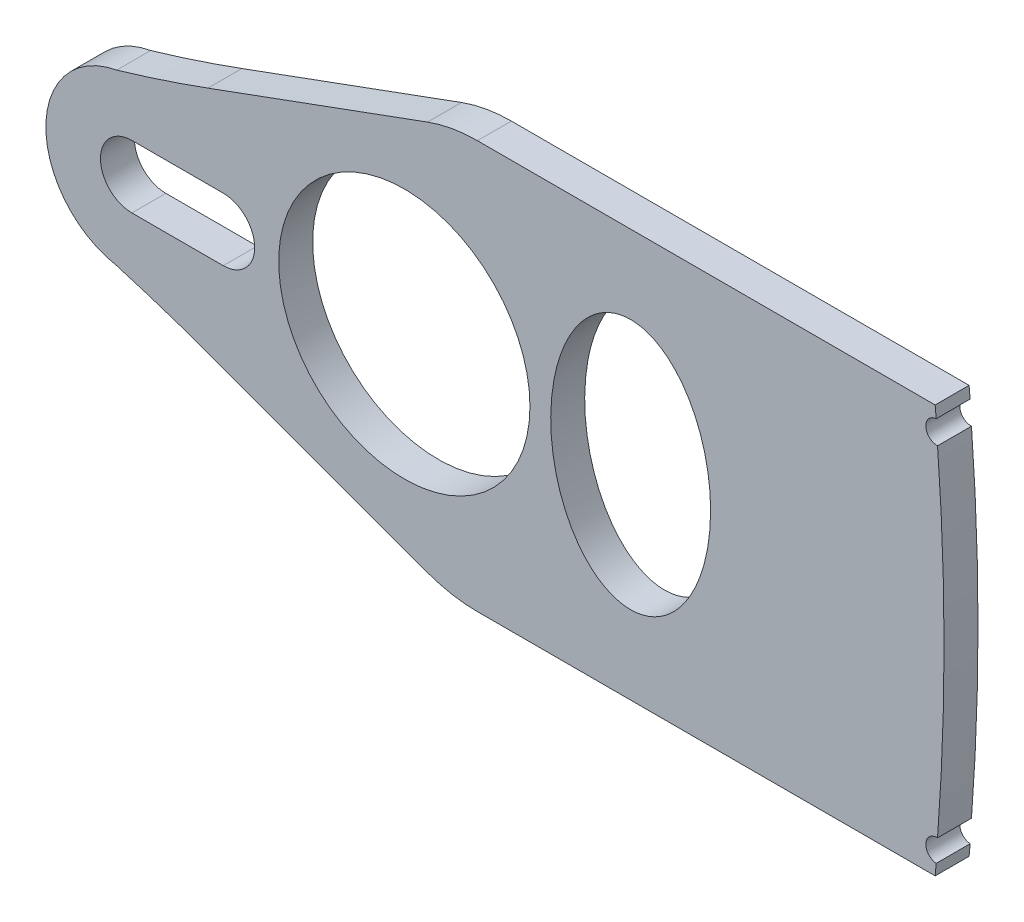
ISO-10303-21;
HEADER;
FILE_DESCRIPTION(('STEP AP214'),'2;1');
FILE_NAME('part.step','',(''),(''),'','','');
FILE_SCHEMA(('AUTOMOTIVE_DESIGN { 1 0 10303 214 1 1 1 1 }'));
ENDSEC;
DATA;
#1=APPLICATION_CONTEXT('core data for automotive mechanical design processes');
#2=APPLICATION_PROTOCOL_DEFINITION('international standard','automotive_design',2000,#1);
#3=PRODUCT_CONTEXT('',#1,'mechanical');
#4=PRODUCT('Part','Part','',(#3));
#5=PRODUCT_RELATED_PRODUCT_CATEGORY('part','',(#4));
#6=PRODUCT_DEFINITION_FORMATION('','',#4);
#7=PRODUCT_DEFINITION_CONTEXT('part definition',#1,'design');
#8=PRODUCT_DEFINITION('design','',#6,#7);
#9=PRODUCT_DEFINITION_SHAPE('','',#8);
#10=(LENGTH_UNIT() NAMED_UNIT(*) SI_UNIT(.MILLI.,.METRE.));
#11=(NAMED_UNIT(*) PLANE_ANGLE_UNIT() SI_UNIT($,.RADIAN.));
#12=(NAMED_UNIT(*) SI_UNIT($,.STERADIAN.) SOLID_ANGLE_UNIT());
#13=UNCERTAINTY_MEASURE_WITH_UNIT(LENGTH_MEASURE(1.E-05),#10,'distance_accuracy_value','');
#14=(GEOMETRIC_REPRESENTATION_CONTEXT(3) GLOBAL_UNCERTAINTY_ASSIGNED_CONTEXT((#13)) GLOBAL_UNIT_ASSIGNED_CONTEXT((#10,
#11,#12)) REPRESENTATION_CONTEXT('',''));
#15=CARTESIAN_POINT('',(0.,0.,0.));
#16=DIRECTION('',(0.,0.,1.));
#17=DIRECTION('',(1.,0.,0.));
#18=AXIS2_PLACEMENT_3D('',#15,#16,#17);
#19=CARTESIAN_POINT('',(-61.9531726060395,133.375978359004,3.));
#20=DIRECTION('',(0.,0.,-1.));
#21=DIRECTION('',(-1.,0.,0.));
#22=AXIS2_PLACEMENT_3D('',#19,#20,#21);
#23=PLANE('',#22);
#24=CARTESIAN_POINT('',(-61.9531726060395,133.375978359004,3.));
#25=DIRECTION('',(0.,0.,-1.));
#26=DIRECTION('',(-1.,0.,0.));
#27=AXIS2_PLACEMENT_3D('',#24,#25,#26);
#28=CIRCLE('',#27,128.167082660278);
#29=CARTESIAN_POINT('',(-17.8942149727587,13.0198014094375,3.));
#30=VERTEX_POINT('',#29);
#31=CARTESIAN_POINT('',(-25.9650650638676,10.3651772349564,3.));
#32=VERTEX_POINT('',#31);
#33=EDGE_CURVE('E222',#30,#32,#28,.T.);
#34=ORIENTED_EDGE('',*,*,#33,.T.);
#35=CARTESIAN_POINT('',(-24.6190531676033,2.88218977755966,3.));
#36=DIRECTION('',(0.,0.,1.));
#37=DIRECTION('',(1.,0.,0.));
#38=AXIS2_PLACEMENT_3D('',#35,#36,#37);
#39=CIRCLE('',#38,7.60308156686761);
#40=CARTESIAN_POINT('',(-25.9650650638673,-4.60079767983714,3.));
#41=VERTEX_POINT('',#40);
#42=EDGE_CURVE('E226',#32,#41,#39,.T.);
#43=ORIENTED_EDGE('',*,*,#42,.T.);
#44=CARTESIAN_POINT('',(-61.953172606039,-127.611598803884,3.));
#45=DIRECTION('',(0.,0.,-1.));
#46=DIRECTION('',(1.,0.,0.));
#47=AXIS2_PLACEMENT_3D('',#44,#45,#46);
#48=CIRCLE('',#47,128.167082660278);
#49=CARTESIAN_POINT('',(-17.8942149727582,-7.25542185431699,3.));
#50=VERTEX_POINT('',#49);
#51=EDGE_CURVE('E230',#41,#50,#48,.T.);
#52=ORIENTED_EDGE('',*,*,#51,.T.);
#53=DIRECTION('',(0.939056850256712,-0.343761882683264,0.));
#54=VECTOR('',#53,1.);
#55=CARTESIAN_POINT('',(-17.8942149727587,-7.25542185431823,3.));
#56=LINE('',#55,#54);
#57=CARTESIAN_POINT('',(1.50454556699025,-14.3567538376193,3.));
#58=VERTEX_POINT('',#57);
#59=EDGE_CURVE('E233',#50,#58,#56,.T.);
#60=ORIENTED_EDGE('',*,*,#59,.T.);
#61=CARTESIAN_POINT('',(5.91044133032117,-2.3211361426666,3.));
#62=DIRECTION('',(0.,0.,1.));
#63=DIRECTION('',(1.,0.,0.));
#64=AXIS2_PLACEMENT_3D('',#61,#62,#63);
#65=CIRCLE('',#64,12.8167082660263);
#66=CARTESIAN_POINT('',(5.91044133032854,-15.1378444086929,3.));
#67=VERTEX_POINT('',#66);
#68=EDGE_CURVE('E236',#58,#67,#65,.T.);
#69=ORIENTED_EDGE('',*,*,#68,.T.);
#70=DIRECTION('',(1.,0.,0.));
#71=VECTOR('',#70,1.);
#72=CARTESIAN_POINT('',(5.91044133032854,-15.1378444086942,3.));
#73=LINE('',#72,#71);
#74=CARTESIAN_POINT('',(46.3587127440441,-15.1378444086928,3.));
#75=VERTEX_POINT('',#74);
#76=EDGE_CURVE('E239',#67,#75,#73,.T.);
#77=ORIENTED_EDGE('',*,*,#76,.T.);
#78=CARTESIAN_POINT('',(-148.703303072536,2.88218977755966,3.));
#79=DIRECTION('',(0.,0.,1.));
#80=DIRECTION('',(1.,0.,0.));
#81=AXIS2_PLACEMENT_3D('',#78,#79,#80);
#82=CIRCLE('',#81,195.892602327146);
#83=CARTESIAN_POINT('',(46.449065207589,-14.1314753525609,3.));
#84=VERTEX_POINT('',#83);
#85=EDGE_CURVE('E242',#75,#84,#82,.T.);
#86=ORIENTED_EDGE('',*,*,#85,.T.);
#87=CARTESIAN_POINT('',(46.5427389297689,-13.1266425617359,3.));
#88=DIRECTION('',(0.,0.,-1.));
#89=DIRECTION('',(1.,0.,0.));
#90=AXIS2_PLACEMENT_3D('',#87,#88,#89);
#91=CIRCLE('',#90,1.00918962724762);
#92=CARTESIAN_POINT('',(46.5695906510489,-12.1178102224403,3.));
#93=VERTEX_POINT('',#92);
#94=EDGE_CURVE('E245',#84,#93,#91,.T.);
#95=ORIENTED_EDGE('',*,*,#94,.T.);
#96=CARTESIAN_POINT('',(-148.703303072536,2.88218977755966,3.));
#97=DIRECTION('',(0.,0.,1.));
#98=DIRECTION('',(1.,0.,0.));
#99=AXIS2_PLACEMENT_3D('',#96,#97,#98);
#100=CIRCLE('',#99,195.848163185624);
#101=CARTESIAN_POINT('',(46.5695906510489,17.8821897775597,3.));
#102=VERTEX_POINT('',#101);
#103=EDGE_CURVE('E248',#93,#102,#100,.T.);
#104=ORIENTED_EDGE('',*,*,#103,.T.);
#105=CARTESIAN_POINT('',(46.5427389297689,18.8910221168552,3.));
#106=DIRECTION('',(0.,0.,-1.));
#107=DIRECTION('',(-1.,0.,0.));
#108=AXIS2_PLACEMENT_3D('',#105,#106,#107);
#109=CIRCLE('',#108,1.00918962724762);
#110=CARTESIAN_POINT('',(46.4490652075891,19.8958549076802,3.));
#111=VERTEX_POINT('',#110);
#112=EDGE_CURVE('E251',#102,#111,#109,.T.);
#113=ORIENTED_EDGE('',*,*,#112,.T.);
#114=CARTESIAN_POINT('',(-148.703303072536,2.88218977755966,3.));
#115=DIRECTION('',(0.,0.,1.));
#116=DIRECTION('',(-1.,0.,0.));
#117=AXIS2_PLACEMENT_3D('',#114,#115,#116);
#118=CIRCLE('',#117,195.892602327146);
#119=CARTESIAN_POINT('',(46.358712744044,20.9022239638122,3.));
#120=VERTEX_POINT('',#119);
#121=EDGE_CURVE('E254',#111,#120,#118,.T.);
#122=ORIENTED_EDGE('',*,*,#121,.T.);
#123=DIRECTION('',(-1.,0.,0.));
#124=VECTOR('',#123,1.);
#125=CARTESIAN_POINT('',(28.8261972357436,20.9022239638122,3.));
#126=LINE('',#125,#124);
#127=CARTESIAN_POINT('',(5.91044133032854,20.9022239638122,3.));
#128=VERTEX_POINT('',#127);
#129=EDGE_CURVE('E257',#120,#128,#126,.T.);
#130=ORIENTED_EDGE('',*,*,#129,.T.);
#131=CARTESIAN_POINT('',(5.91044133032117,8.08551569778591,3.));
#132=DIRECTION('',(0.,0.,1.));
#133=DIRECTION('',(-1.,0.,0.));
#134=AXIS2_PLACEMENT_3D('',#131,#132,#133);
#135=CIRCLE('',#134,12.8167082660257);
#136=CARTESIAN_POINT('',(1.50454556699003,20.1211333927392,3.));
#137=VERTEX_POINT('',#136);
#138=EDGE_CURVE('E260',#128,#137,#135,.T.);
#139=ORIENTED_EDGE('',*,*,#138,.T.);
#140=DIRECTION('',(-0.939056850256712,-0.343761882683264,0.));
#141=VECTOR('',#140,1.);
#142=CARTESIAN_POINT('',(-17.8942149727587,13.0198014094375,3.));
#143=LINE('',#142,#141);
#144=EDGE_CURVE('E263',#137,#30,#143,.T.);
#145=ORIENTED_EDGE('',*,*,#144,.T.);
#146=EDGE_LOOP('',(#34,#43,#52,#60,#69,#77,#86,#95,#104,#113,#122,#130,#139,#145));
#147=FACE_BOUND('',#146,.T.);
#148=CARTESIAN_POINT('',(-24.6190531676033,2.88218977755966,3.));
#149=DIRECTION('',(0.,0.,1.));
#150=DIRECTION('',(1.,0.,0.));
#151=AXIS2_PLACEMENT_3D('',#148,#149,#150);
#152=CIRCLE('',#151,2.77527147492525);
#153=CARTESIAN_POINT('',(-24.6190531676033,5.6574612524849,3.));
#154=VERTEX_POINT('',#153);
#155=CARTESIAN_POINT('',(-24.6190531676033,0.10691830263441,3.));
#156=VERTEX_POINT('',#155);
#157=EDGE_CURVE('E171',#154,#156,#152,.T.);
#158=ORIENTED_EDGE('',*,*,#157,.F.);
#159=DIRECTION('',(-1.,0.,0.));
#160=VECTOR('',#159,1.);
#161=CARTESIAN_POINT('',(-16.5455361496331,5.65746125248479,3.));
#162=LINE('',#161,#160);
#163=CARTESIAN_POINT('',(-16.5455361496331,5.65746125248478,3.));
#164=VERTEX_POINT('',#163);
#165=EDGE_CURVE('E198',#164,#154,#162,.T.);
#166=ORIENTED_EDGE('',*,*,#165,.F.);
#167=CARTESIAN_POINT('',(-16.5455361496331,2.88218977755966,3.));
#168=DIRECTION('',(0.,0.,1.));
#169=DIRECTION('',(1.,0.,0.));
#170=AXIS2_PLACEMENT_3D('',#167,#168,#169);
#171=CIRCLE('',#170,2.77527147492514);
#172=CARTESIAN_POINT('',(-16.5455361496331,0.106918302634519,3.));
#173=VERTEX_POINT('',#172);
#174=EDGE_CURVE('E194',#173,#164,#171,.T.);
#175=ORIENTED_EDGE('',*,*,#174,.F.);
#176=DIRECTION('',(1.,0.,0.));
#177=VECTOR('',#176,1.);
#178=CARTESIAN_POINT('',(-16.5455361496331,0.10691830263452,3.));
#179=LINE('',#178,#177);
#180=EDGE_CURVE('E180',#156,#173,#179,.T.);
#181=ORIENTED_EDGE('',*,*,#180,.F.);
#182=EDGE_LOOP('',(#158,#166,#175,#181));
#183=FACE_BOUND('',#182,.T.);
#184=CARTESIAN_POINT('',(-0.545536149633069,2.88218977755966,3.));
#185=DIRECTION('',(0.,0.,1.));
#186=DIRECTION('',(1.,0.,0.));
#187=AXIS2_PLACEMENT_3D('',#184,#185,#186);
#188=CIRCLE('',#187,11.101085899709);
#189=CARTESIAN_POINT('',(10.555549750076,2.88218977755966,3.));
#190=VERTEX_POINT('',#189);
#191=EDGE_CURVE('E206',#190,#190,#188,.T.);
#192=ORIENTED_EDGE('',*,*,#191,.F.);
#193=EDGE_LOOP('',(#192));
#194=FACE_BOUND('',#193,.T.);
#195=CARTESIAN_POINT('',(19.4544638503669,2.88218977755966,3.));
#196=DIRECTION('',(0.,0.,1.));
#197=DIRECTION('',(9.43534753498491E-13,-1.,0.));
#198=AXIS2_PLACEMENT_3D('',#195,#196,#197);
#199=ELLIPSE('',#198,11.1010858997095,7.06432739072393);
#200=CARTESIAN_POINT('',(19.4544638503774,-8.21889612214983,3.));
#201=VERTEX_POINT('',#200);
#202=EDGE_CURVE('E624',#201,#201,#199,.T.);
#203=ORIENTED_EDGE('',*,*,#202,.F.);
#204=EDGE_LOOP('',(#203));
#205=FACE_BOUND('',#204,.T.);
#206=ADVANCED_FACE('F45',(#147,#183,#194,#205),#23,.F.);
#207=CARTESIAN_POINT('',(-61.9531726060395,133.375978359004,0.));
#208=DIRECTION('',(0.,0.,-1.));
#209=DIRECTION('',(-1.,0.,0.));
#210=AXIS2_PLACEMENT_3D('',#207,#208,#209);
#211=PLANE('',#210);
#212=CARTESIAN_POINT('',(-0.545536149633069,2.88218977755966,0.));
#213=DIRECTION('',(0.,0.,1.));
#214=DIRECTION('',(1.,0.,0.));
#215=AXIS2_PLACEMENT_3D('',#212,#213,#214);
#216=CIRCLE('',#215,11.101085899709);
#217=CARTESIAN_POINT('',(10.555549750076,2.88218977755966,0.));
#218=VERTEX_POINT('',#217);
#219=EDGE_CURVE('E628',#218,#218,#216,.T.);
#220=ORIENTED_EDGE('',*,*,#219,.T.);
#221=EDGE_LOOP('',(#220));
#222=FACE_BOUND('',#221,.T.);
#223=CARTESIAN_POINT('',(-61.9531726060395,133.375978359004,0.));
#224=DIRECTION('',(0.,0.,-1.));
#225=DIRECTION('',(-1.,0.,0.));
#226=AXIS2_PLACEMENT_3D('',#223,#224,#225);
#227=CIRCLE('',#226,128.167082660278);
#228=CARTESIAN_POINT('',(-17.8942149727587,13.0198014094375,0.));
#229=VERTEX_POINT('',#228);
#230=CARTESIAN_POINT('',(-25.9650650638676,10.3651772349564,0.));
#231=VERTEX_POINT('',#230);
#232=EDGE_CURVE('E189',#229,#231,#227,.T.);
#233=ORIENTED_EDGE('',*,*,#232,.F.);
#234=DIRECTION('',(-0.939056850256712,-0.343761882683264,0.));
#235=VECTOR('',#234,1.);
#236=CARTESIAN_POINT('',(-17.8942149727587,13.0198014094375,0.));
#237=LINE('',#236,#235);
#238=CARTESIAN_POINT('',(1.50454556699003,20.1211333927392,0.));
#239=VERTEX_POINT('',#238);
#240=EDGE_CURVE('E227',#239,#229,#237,.T.);
#241=ORIENTED_EDGE('',*,*,#240,.F.);
#242=CARTESIAN_POINT('',(5.91044133032117,8.08551569778591,0.));
#243=DIRECTION('',(0.,0.,1.));
#244=DIRECTION('',(-1.,0.,0.));
#245=AXIS2_PLACEMENT_3D('',#242,#243,#244);
#246=CIRCLE('',#245,12.8167082660257);
#247=CARTESIAN_POINT('',(5.91044133032854,20.9022239638122,0.));
#248=VERTEX_POINT('',#247);
#249=EDGE_CURVE('E307',#248,#239,#246,.T.);
#250=ORIENTED_EDGE('',*,*,#249,.F.);
#251=DIRECTION('',(-1.,0.,0.));
#252=VECTOR('',#251,1.);
#253=CARTESIAN_POINT('',(5.91044133032854,20.9022239638122,0.));
#254=LINE('',#253,#252);
#255=CARTESIAN_POINT('',(46.358712744044,20.9022239638122,0.));
#256=VERTEX_POINT('',#255);
#257=EDGE_CURVE('E304',#256,#248,#254,.T.);
#258=ORIENTED_EDGE('',*,*,#257,.F.);
#259=CARTESIAN_POINT('',(-148.703303072536,2.88218977755966,0.));
#260=DIRECTION('',(0.,0.,1.));
#261=DIRECTION('',(-1.,0.,0.));
#262=AXIS2_PLACEMENT_3D('',#259,#260,#261);
#263=CIRCLE('',#262,195.892602327146);
#264=CARTESIAN_POINT('',(46.4490652075891,19.8958549076802,0.));
#265=VERTEX_POINT('',#264);
#266=EDGE_CURVE('E300',#265,#256,#263,.T.);
#267=ORIENTED_EDGE('',*,*,#266,.F.);
#268=CARTESIAN_POINT('',(46.5427389297689,18.8910221168552,0.));
#269=DIRECTION('',(0.,0.,-1.));
#270=DIRECTION('',(-1.,0.,0.));
#271=AXIS2_PLACEMENT_3D('',#268,#269,#270);
#272=CIRCLE('',#271,1.00918962724762);
#273=CARTESIAN_POINT('',(46.5695906510489,17.8821897775597,0.));
#274=VERTEX_POINT('',#273);
#275=EDGE_CURVE('E297',#274,#265,#272,.T.);
#276=ORIENTED_EDGE('',*,*,#275,.F.);
#277=CARTESIAN_POINT('',(-148.703303072536,2.88218977755966,0.));
#278=DIRECTION('',(0.,0.,1.));
#279=DIRECTION('',(1.,0.,0.));
#280=AXIS2_PLACEMENT_3D('',#277,#278,#279);
#281=CIRCLE('',#280,195.848163185624);
#282=CARTESIAN_POINT('',(46.5695906510489,-12.1178102224403,0.));
#283=VERTEX_POINT('',#282);
#284=EDGE_CURVE('E293',#283,#274,#281,.T.);
#285=ORIENTED_EDGE('',*,*,#284,.F.);
#286=CARTESIAN_POINT('',(46.5427389297689,-13.1266425617359,0.));
#287=DIRECTION('',(0.,0.,-1.));
#288=DIRECTION('',(1.,0.,0.));
#289=AXIS2_PLACEMENT_3D('',#286,#287,#288);
#290=CIRCLE('',#289,1.00918962724762);
#291=CARTESIAN_POINT('',(46.449065207589,-14.1314753525609,0.));
#292=VERTEX_POINT('',#291);
#293=EDGE_CURVE('E290',#292,#283,#290,.T.);
#294=ORIENTED_EDGE('',*,*,#293,.F.);
#295=CARTESIAN_POINT('',(-148.703303072536,2.88218977755966,0.));
#296=DIRECTION('',(0.,0.,1.));
#297=DIRECTION('',(1.,0.,0.));
#298=AXIS2_PLACEMENT_3D('',#295,#296,#297);
#299=CIRCLE('',#298,195.892602327146);
#300=CARTESIAN_POINT('',(46.3587127440441,-15.1378444086928,0.));
#301=VERTEX_POINT('',#300);
#302=EDGE_CURVE('E286',#301,#292,#299,.T.);
#303=ORIENTED_EDGE('',*,*,#302,.F.);
#304=DIRECTION('',(1.,0.,0.));
#305=VECTOR('',#304,1.);
#306=CARTESIAN_POINT('',(28.8261972357436,-15.1378444086942,0.));
#307=LINE('',#306,#305);
#308=CARTESIAN_POINT('',(5.91044133032854,-15.1378444086929,0.));
#309=VERTEX_POINT('',#308);
#310=EDGE_CURVE('E283',#309,#301,#307,.T.);
#311=ORIENTED_EDGE('',*,*,#310,.F.);
#312=CARTESIAN_POINT('',(5.91044133032117,-2.3211361426666,0.));
#313=DIRECTION('',(0.,0.,1.));
#314=DIRECTION('',(1.,0.,0.));
#315=AXIS2_PLACEMENT_3D('',#312,#313,#314);
#316=CIRCLE('',#315,12.8167082660263);
#317=CARTESIAN_POINT('',(1.50454556699025,-14.3567538376193,0.));
#318=VERTEX_POINT('',#317);
#319=EDGE_CURVE('E279',#318,#309,#316,.T.);
#320=ORIENTED_EDGE('',*,*,#319,.F.);
#321=DIRECTION('',(0.939056850256712,-0.343761882683264,0.));
#322=VECTOR('',#321,1.);
#323=CARTESIAN_POINT('',(-17.8942149727587,-7.25542185431823,0.));
#324=LINE('',#323,#322);
#325=CARTESIAN_POINT('',(-17.8942149727582,-7.25542185431699,0.));
#326=VERTEX_POINT('',#325);
#327=EDGE_CURVE('E276',#326,#318,#324,.T.);
#328=ORIENTED_EDGE('',*,*,#327,.F.);
#329=CARTESIAN_POINT('',(-61.953172606039,-127.611598803884,0.));
#330=DIRECTION('',(0.,0.,-1.));
#331=DIRECTION('',(1.,0.,0.));
#332=AXIS2_PLACEMENT_3D('',#329,#330,#331);
#333=CIRCLE('',#332,128.167082660278);
#334=CARTESIAN_POINT('',(-25.9650650638673,-4.60079767983714,0.));
#335=VERTEX_POINT('',#334);
#336=EDGE_CURVE('E273',#335,#326,#333,.T.);
#337=ORIENTED_EDGE('',*,*,#336,.F.);
#338=CARTESIAN_POINT('',(-24.6190531676033,2.88218977755966,0.));
#339=DIRECTION('',(0.,0.,1.));
#340=DIRECTION('',(1.,0.,0.));
#341=AXIS2_PLACEMENT_3D('',#338,#339,#340);
#342=CIRCLE('',#341,7.60308156686761);
#343=EDGE_CURVE('E270',#231,#335,#342,.T.);
#344=ORIENTED_EDGE('',*,*,#343,.F.);
#345=EDGE_LOOP('',(#233,#241,#250,#258,#267,#276,#285,#294,#303,#311,#320,#328,#337,#344));
#346=FACE_BOUND('',#345,.T.);
#347=DIRECTION('',(-1.,0.,0.));
#348=VECTOR('',#347,1.);
#349=CARTESIAN_POINT('',(-16.5455361496331,5.65746125248479,0.));
#350=LINE('',#349,#348);
#351=CARTESIAN_POINT('',(-16.5455361496331,5.65746125248479,0.));
#352=VERTEX_POINT('',#351);
#353=CARTESIAN_POINT('',(-24.6190531676033,5.65746125248489,0.));
#354=VERTEX_POINT('',#353);
#355=EDGE_CURVE('E181',#352,#354,#350,.T.);
#356=ORIENTED_EDGE('',*,*,#355,.T.);
#357=CARTESIAN_POINT('',(-24.6190531676033,2.88218977755966,0.));
#358=DIRECTION('',(0.,0.,1.));
#359=DIRECTION('',(1.,0.,0.));
#360=AXIS2_PLACEMENT_3D('',#357,#358,#359);
#361=CIRCLE('',#360,2.77527147492525);
#362=CARTESIAN_POINT('',(-24.6190531676033,0.10691830263441,0.));
#363=VERTEX_POINT('',#362);
#364=EDGE_CURVE('E69',#354,#363,#361,.T.);
#365=ORIENTED_EDGE('',*,*,#364,.T.);
#366=DIRECTION('',(1.,0.,0.));
#367=VECTOR('',#366,1.);
#368=CARTESIAN_POINT('',(-16.5455361496331,0.10691830263452,0.));
#369=LINE('',#368,#367);
#370=CARTESIAN_POINT('',(-16.5455361496331,0.106918302634519,0.));
#371=VERTEX_POINT('',#370);
#372=EDGE_CURVE('E187',#363,#371,#369,.T.);
#373=ORIENTED_EDGE('',*,*,#372,.T.);
#374=CARTESIAN_POINT('',(-16.5455361496331,2.88218977755966,0.));
#375=DIRECTION('',(0.,0.,1.));
#376=DIRECTION('',(1.,0.,0.));
#377=AXIS2_PLACEMENT_3D('',#374,#375,#376);
#378=CIRCLE('',#377,2.77527147492514);
#379=EDGE_CURVE('E209',#371,#352,#378,.T.);
#380=ORIENTED_EDGE('',*,*,#379,.T.);
#381=EDGE_LOOP('',(#356,#365,#373,#380));
#382=FACE_BOUND('',#381,.T.);
#383=CARTESIAN_POINT('',(19.4544638503669,2.88218977755966,0.));
#384=DIRECTION('',(0.,0.,1.));
#385=DIRECTION('',(9.43534753498491E-13,-1.,0.));
#386=AXIS2_PLACEMENT_3D('',#383,#384,#385);
#387=ELLIPSE('',#386,11.1010858997095,7.06432739072393);
#388=CARTESIAN_POINT('',(19.4544638503774,-8.21889612214983,0.));
#389=VERTEX_POINT('',#388);
#390=EDGE_CURVE('E629',#389,#389,#387,.T.);
#391=ORIENTED_EDGE('',*,*,#390,.T.);
#392=EDGE_LOOP('',(#391));
#393=FACE_BOUND('',#392,.T.);
#394=ADVANCED_FACE('F370',(#222,#346,#382,#393),#211,.T.);
#395=CARTESIAN_POINT('',(-61.9531726060395,133.375978359004,3.));
#396=DIRECTION('',(0.,0.,-1.));
#397=DIRECTION('',(-1.,0.,0.));
#398=AXIS2_PLACEMENT_3D('',#395,#396,#397);
#399=CYLINDRICAL_SURFACE('',#398,128.167082660278);
#400=ORIENTED_EDGE('',*,*,#232,.T.);
#401=DIRECTION('',(0.,0.,-1.));
#402=VECTOR('',#401,1.);
#403=CARTESIAN_POINT('',(-25.9650650638676,10.3651772349564,3.));
#404=LINE('',#403,#402);
#405=EDGE_CURVE('E11',#32,#231,#404,.T.);
#406=ORIENTED_EDGE('',*,*,#405,.F.);
#407=ORIENTED_EDGE('',*,*,#33,.F.);
#408=DIRECTION('',(0.,0.,-1.));
#409=VECTOR('',#408,1.);
#410=CARTESIAN_POINT('',(-17.8942149727587,13.0198014094375,3.));
#411=LINE('',#410,#409);
#412=EDGE_CURVE('E266',#30,#229,#411,.T.);
#413=ORIENTED_EDGE('',*,*,#412,.T.);
#414=EDGE_LOOP('',(#400,#406,#407,#413));
#415=FACE_BOUND('',#414,.T.);
#416=ADVANCED_FACE('F47',(#415),#399,.F.);
#417=CARTESIAN_POINT('',(-24.6190531676033,2.88218977755966,3.));
#418=DIRECTION('',(0.,0.,-1.));
#419=DIRECTION('',(-1.,0.,0.));
#420=AXIS2_PLACEMENT_3D('',#417,#418,#419);
#421=CYLINDRICAL_SURFACE('',#420,7.60308156686761);
#422=ORIENTED_EDGE('',*,*,#343,.T.);
#423=DIRECTION('',(0.,0.,-1.));
#424=VECTOR('',#423,1.);
#425=CARTESIAN_POINT('',(-25.9650650638673,-4.60079767983714,3.));
#426=LINE('',#425,#424);
#427=EDGE_CURVE('E54',#41,#335,#426,.T.);
#428=ORIENTED_EDGE('',*,*,#427,.F.);
#429=ORIENTED_EDGE('',*,*,#42,.F.);
#430=ORIENTED_EDGE('',*,*,#405,.T.);
#431=EDGE_LOOP('',(#422,#428,#429,#430));
#432=FACE_BOUND('',#431,.T.);
#433=ADVANCED_FACE('F386',(#432),#421,.T.);
#434=CARTESIAN_POINT('',(-61.953172606039,-127.611598803884,3.));
#435=DIRECTION('',(0.,0.,-1.));
#436=DIRECTION('',(-1.,0.,0.));
#437=AXIS2_PLACEMENT_3D('',#434,#435,#436);
#438=CYLINDRICAL_SURFACE('',#437,128.167082660278);
#439=ORIENTED_EDGE('',*,*,#336,.T.);
#440=DIRECTION('',(0.,0.,-1.));
#441=VECTOR('',#440,1.);
#442=CARTESIAN_POINT('',(-17.8942149727582,-7.25542185431699,3.));
#443=LINE('',#442,#441);
#444=EDGE_CURVE('E355',#50,#326,#443,.T.);
#445=ORIENTED_EDGE('',*,*,#444,.F.);
#446=ORIENTED_EDGE('',*,*,#51,.F.);
#447=ORIENTED_EDGE('',*,*,#427,.T.);
#448=EDGE_LOOP('',(#439,#445,#446,#447));
#449=FACE_BOUND('',#448,.T.);
#450=ADVANCED_FACE('F364',(#449),#438,.F.);
#451=CARTESIAN_POINT('',(-17.8942149727587,-7.25542185431823,3.));
#452=DIRECTION('',(0.343761882683264,0.939056850256712,0.));
#453=DIRECTION('',(-0.939056850256713,0.343761882683264,0.));
#454=AXIS2_PLACEMENT_3D('',#451,#452,#453);
#455=PLANE('',#454);
#456=ORIENTED_EDGE('',*,*,#327,.T.);
#457=DIRECTION('',(0.,0.,-1.));
#458=VECTOR('',#457,1.);
#459=CARTESIAN_POINT('',(1.50454556699025,-14.3567538376193,3.));
#460=LINE('',#459,#458);
#461=EDGE_CURVE('E351',#58,#318,#460,.T.);
#462=ORIENTED_EDGE('',*,*,#461,.F.);
#463=ORIENTED_EDGE('',*,*,#59,.F.);
#464=ORIENTED_EDGE('',*,*,#444,.T.);
#465=EDGE_LOOP('',(#456,#462,#463,#464));
#466=FACE_BOUND('',#465,.T.);
#467=ADVANCED_FACE('F375',(#466),#455,.F.);
#468=CARTESIAN_POINT('',(5.91044133032117,-2.3211361426666,3.));
#469=DIRECTION('',(0.,0.,-1.));
#470=DIRECTION('',(-1.,0.,0.));
#471=AXIS2_PLACEMENT_3D('',#468,#469,#470);
#472=CYLINDRICAL_SURFACE('',#471,12.8167082660263);
#473=ORIENTED_EDGE('',*,*,#319,.T.);
#474=DIRECTION('',(0.,0.,-1.));
#475=VECTOR('',#474,1.);
#476=CARTESIAN_POINT('',(5.91044133032854,-15.1378444086929,3.));
#477=LINE('',#476,#475);
#478=EDGE_CURVE('E347',#67,#309,#477,.T.);
#479=ORIENTED_EDGE('',*,*,#478,.F.);
#480=ORIENTED_EDGE('',*,*,#68,.F.);
#481=ORIENTED_EDGE('',*,*,#461,.T.);
#482=EDGE_LOOP('',(#473,#479,#480,#481));
#483=FACE_BOUND('',#482,.T.);
#484=ADVANCED_FACE('F379',(#483),#472,.T.);
#485=CARTESIAN_POINT('',(28.8261972357436,-15.1378444086942,3.));
#486=DIRECTION('',(0.,1.,0.));
#487=DIRECTION('',(-1.,0.,0.));
#488=AXIS2_PLACEMENT_3D('',#485,#486,#487);
#489=PLANE('',#488);
#490=ORIENTED_EDGE('',*,*,#310,.T.);
#491=DIRECTION('',(0.,0.,-1.));
#492=VECTOR('',#491,1.);
#493=CARTESIAN_POINT('',(46.3587127440441,-15.1378444086928,3.));
#494=LINE('',#493,#492);
#495=EDGE_CURVE('E343',#75,#301,#494,.T.);
#496=ORIENTED_EDGE('',*,*,#495,.F.);
#497=ORIENTED_EDGE('',*,*,#76,.F.);
#498=ORIENTED_EDGE('',*,*,#478,.T.);
#499=EDGE_LOOP('',(#490,#496,#497,#498));
#500=FACE_BOUND('',#499,.T.);
#501=ADVANCED_FACE('F426',(#500),#489,.F.);
#502=CARTESIAN_POINT('',(-148.703303072536,2.88218977755966,3.));
#503=DIRECTION('',(0.,0.,-1.));
#504=DIRECTION('',(-1.,0.,0.));
#505=AXIS2_PLACEMENT_3D('',#502,#503,#504);
#506=CYLINDRICAL_SURFACE('',#505,195.892602327146);
#507=ORIENTED_EDGE('',*,*,#302,.T.);
#508=DIRECTION('',(0.,0.,-1.));
#509=VECTOR('',#508,1.);
#510=CARTESIAN_POINT('',(46.449065207589,-14.1314753525609,3.));
#511=LINE('',#510,#509);
#512=EDGE_CURVE('E339',#84,#292,#511,.T.);
#513=ORIENTED_EDGE('',*,*,#512,.F.);
#514=ORIENTED_EDGE('',*,*,#85,.F.);
#515=ORIENTED_EDGE('',*,*,#495,.T.);
#516=EDGE_LOOP('',(#507,#513,#514,#515));
#517=FACE_BOUND('',#516,.T.);
#518=ADVANCED_FACE('F423',(#517),#506,.T.);
#519=CARTESIAN_POINT('',(46.5427389297689,-13.1266425617359,3.));
#520=DIRECTION('',(0.,0.,-1.));
#521=DIRECTION('',(-1.,0.,0.));
#522=AXIS2_PLACEMENT_3D('',#519,#520,#521);
#523=CYLINDRICAL_SURFACE('',#522,1.00918962724762);
#524=ORIENTED_EDGE('',*,*,#293,.T.);
#525=DIRECTION('',(0.,0.,-1.));
#526=VECTOR('',#525,1.);
#527=CARTESIAN_POINT('',(46.5695906510489,-12.1178102224403,3.));
#528=LINE('',#527,#526);
#529=EDGE_CURVE('E335',#93,#283,#528,.T.);
#530=ORIENTED_EDGE('',*,*,#529,.F.);
#531=ORIENTED_EDGE('',*,*,#94,.F.);
#532=ORIENTED_EDGE('',*,*,#512,.T.);
#533=EDGE_LOOP('',(#524,#530,#531,#532));
#534=FACE_BOUND('',#533,.T.);
#535=ADVANCED_FACE('F419',(#534),#523,.F.);
#536=CARTESIAN_POINT('',(-148.703303072536,2.88218977755966,3.));
#537=DIRECTION('',(0.,0.,-1.));
#538=DIRECTION('',(-1.,0.,0.));
#539=AXIS2_PLACEMENT_3D('',#536,#537,#538);
#540=CYLINDRICAL_SURFACE('',#539,195.848163185624);
#541=ORIENTED_EDGE('',*,*,#284,.T.);
#542=DIRECTION('',(0.,0.,-1.));
#543=VECTOR('',#542,1.);
#544=CARTESIAN_POINT('',(46.5695906510489,17.8821897775597,3.));
#545=LINE('',#544,#543);
#546=EDGE_CURVE('E331',#102,#274,#545,.T.);
#547=ORIENTED_EDGE('',*,*,#546,.F.);
#548=ORIENTED_EDGE('',*,*,#103,.F.);
#549=ORIENTED_EDGE('',*,*,#529,.T.);
#550=EDGE_LOOP('',(#541,#547,#548,#549));
#551=FACE_BOUND('',#550,.T.);
#552=ADVANCED_FACE('F414',(#551),#540,.T.);
#553=CARTESIAN_POINT('',(46.5427389297689,18.8910221168552,3.));
#554=DIRECTION('',(0.,0.,-1.));
#555=DIRECTION('',(-1.,0.,0.));
#556=AXIS2_PLACEMENT_3D('',#553,#554,#555);
#557=CYLINDRICAL_SURFACE('',#556,1.00918962724762);
#558=ORIENTED_EDGE('',*,*,#275,.T.);
#559=DIRECTION('',(0.,0.,-1.));
#560=VECTOR('',#559,1.);
#561=CARTESIAN_POINT('',(46.4490652075891,19.8958549076802,3.));
#562=LINE('',#561,#560);
#563=EDGE_CURVE('E327',#111,#265,#562,.T.);
#564=ORIENTED_EDGE('',*,*,#563,.F.);
#565=ORIENTED_EDGE('',*,*,#112,.F.);
#566=ORIENTED_EDGE('',*,*,#546,.T.);
#567=EDGE_LOOP('',(#558,#564,#565,#566));
#568=FACE_BOUND('',#567,.T.);
#569=ADVANCED_FACE('F410',(#568),#557,.F.);
#570=CARTESIAN_POINT('',(-148.703303072536,2.88218977755966,3.));
#571=DIRECTION('',(0.,0.,-1.));
#572=DIRECTION('',(-1.,0.,0.));
#573=AXIS2_PLACEMENT_3D('',#570,#571,#572);
#574=CYLINDRICAL_SURFACE('',#573,195.892602327146);
#575=ORIENTED_EDGE('',*,*,#266,.T.);
#576=DIRECTION('',(0.,0.,-1.));
#577=VECTOR('',#576,1.);
#578=CARTESIAN_POINT('',(46.358712744044,20.9022239638122,3.));
#579=LINE('',#578,#577);
#580=EDGE_CURVE('E323',#120,#256,#579,.T.);
#581=ORIENTED_EDGE('',*,*,#580,.F.);
#582=ORIENTED_EDGE('',*,*,#121,.F.);
#583=ORIENTED_EDGE('',*,*,#563,.T.);
#584=EDGE_LOOP('',(#575,#581,#582,#583));
#585=FACE_BOUND('',#584,.T.);
#586=ADVANCED_FACE('F405',(#585),#574,.T.);
#587=CARTESIAN_POINT('',(5.91044133032854,20.9022239638122,3.));
#588=DIRECTION('',(0.,-1.,0.));
#589=DIRECTION('',(1.,0.,0.));
#590=AXIS2_PLACEMENT_3D('',#587,#588,#589);
#591=PLANE('',#590);
#592=ORIENTED_EDGE('',*,*,#257,.T.);
#593=DIRECTION('',(0.,0.,-1.));
#594=VECTOR('',#593,1.);
#595=CARTESIAN_POINT('',(5.91044133032854,20.9022239638122,3.));
#596=LINE('',#595,#594);
#597=EDGE_CURVE('E319',#128,#248,#596,.T.);
#598=ORIENTED_EDGE('',*,*,#597,.F.);
#599=ORIENTED_EDGE('',*,*,#129,.F.);
#600=ORIENTED_EDGE('',*,*,#580,.T.);
#601=EDGE_LOOP('',(#592,#598,#599,#600));
#602=FACE_BOUND('',#601,.T.);
#603=ADVANCED_FACE('F401',(#602),#591,.F.);
#604=CARTESIAN_POINT('',(5.91044133032117,8.08551569778591,3.));
#605=DIRECTION('',(0.,0.,-1.));
#606=DIRECTION('',(-1.,0.,0.));
#607=AXIS2_PLACEMENT_3D('',#604,#605,#606);
#608=CYLINDRICAL_SURFACE('',#607,12.8167082660257);
#609=ORIENTED_EDGE('',*,*,#249,.T.);
#610=DIRECTION('',(0.,0.,-1.));
#611=VECTOR('',#610,1.);
#612=CARTESIAN_POINT('',(1.50454556699003,20.1211333927392,3.));
#613=LINE('',#612,#611);
#614=EDGE_CURVE('E315',#137,#239,#613,.T.);
#615=ORIENTED_EDGE('',*,*,#614,.F.);
#616=ORIENTED_EDGE('',*,*,#138,.F.);
#617=ORIENTED_EDGE('',*,*,#597,.T.);
#618=EDGE_LOOP('',(#609,#615,#616,#617));
#619=FACE_BOUND('',#618,.T.);
#620=ADVANCED_FACE('F397',(#619),#608,.T.);
#621=CARTESIAN_POINT('',(-17.8942149727587,13.0198014094375,3.));
#622=DIRECTION('',(0.343761882683264,-0.939056850256712,0.));
#623=DIRECTION('',(0.939056850256712,0.343761882683264,0.));
#624=AXIS2_PLACEMENT_3D('',#621,#622,#623);
#625=PLANE('',#624);
#626=ORIENTED_EDGE('',*,*,#240,.T.);
#627=ORIENTED_EDGE('',*,*,#412,.F.);
#628=ORIENTED_EDGE('',*,*,#144,.F.);
#629=ORIENTED_EDGE('',*,*,#614,.T.);
#630=EDGE_LOOP('',(#626,#627,#628,#629));
#631=FACE_BOUND('',#630,.T.);
#632=ADVANCED_FACE('F392',(#631),#625,.F.);
#633=CARTESIAN_POINT('',(-24.6190531676033,2.88218977755966,3.));
#634=DIRECTION('',(0.,0.,-1.));
#635=DIRECTION('',(-1.,0.,0.));
#636=AXIS2_PLACEMENT_3D('',#633,#634,#635);
#637=CYLINDRICAL_SURFACE('',#636,2.77527147492525);
#638=ORIENTED_EDGE('',*,*,#364,.F.);
#639=DIRECTION('',(0.,0.,-1.));
#640=VECTOR('',#639,1.);
#641=CARTESIAN_POINT('',(-24.6190531676033,5.6574612524849,3.));
#642=LINE('',#641,#640);
#643=EDGE_CURVE('E175',#154,#354,#642,.T.);
#644=ORIENTED_EDGE('',*,*,#643,.F.);
#645=ORIENTED_EDGE('',*,*,#157,.T.);
#646=DIRECTION('',(0.,0.,-1.));
#647=VECTOR('',#646,1.);
#648=CARTESIAN_POINT('',(-24.6190531676033,0.10691830263441,3.));
#649=LINE('',#648,#647);
#650=EDGE_CURVE('E174',#156,#363,#649,.T.);
#651=ORIENTED_EDGE('',*,*,#650,.T.);
#652=EDGE_LOOP('',(#638,#644,#645,#651));
#653=FACE_BOUND('',#652,.T.);
#654=ADVANCED_FACE('F173',(#653),#637,.F.);
#655=CARTESIAN_POINT('',(-16.5455361496331,0.10691830263452,3.));
#656=DIRECTION('',(0.,1.,0.));
#657=DIRECTION('',(-1.,0.,0.));
#658=AXIS2_PLACEMENT_3D('',#655,#656,#657);
#659=PLANE('',#658);
#660=ORIENTED_EDGE('',*,*,#372,.F.);
#661=ORIENTED_EDGE('',*,*,#650,.F.);
#662=ORIENTED_EDGE('',*,*,#180,.T.);
#663=DIRECTION('',(0.,0.,-1.));
#664=VECTOR('',#663,1.);
#665=CARTESIAN_POINT('',(-16.5455361496331,0.106918302634519,3.));
#666=LINE('',#665,#664);
#667=EDGE_CURVE('E190',#173,#371,#666,.T.);
#668=ORIENTED_EDGE('',*,*,#667,.T.);
#669=EDGE_LOOP('',(#660,#661,#662,#668));
#670=FACE_BOUND('',#669,.T.);
#671=ADVANCED_FACE('F184',(#670),#659,.T.);
#672=CARTESIAN_POINT('',(-16.5455361496331,2.88218977755966,3.));
#673=DIRECTION('',(0.,0.,-1.));
#674=DIRECTION('',(-1.,0.,0.));
#675=AXIS2_PLACEMENT_3D('',#672,#673,#674);
#676=CYLINDRICAL_SURFACE('',#675,2.77527147492514);
#677=ORIENTED_EDGE('',*,*,#379,.F.);
#678=ORIENTED_EDGE('',*,*,#667,.F.);
#679=ORIENTED_EDGE('',*,*,#174,.T.);
#680=DIRECTION('',(0.,0.,-1.));
#681=VECTOR('',#680,1.);
#682=CARTESIAN_POINT('',(-16.5455361496331,5.65746125248479,3.));
#683=LINE('',#682,#681);
#684=EDGE_CURVE('E61',#164,#352,#683,.T.);
#685=ORIENTED_EDGE('',*,*,#684,.T.);
#686=EDGE_LOOP('',(#677,#678,#679,#685));
#687=FACE_BOUND('',#686,.T.);
#688=ADVANCED_FACE('F505',(#687),#676,.F.);
#689=CARTESIAN_POINT('',(-16.5455361496331,5.65746125248479,3.));
#690=DIRECTION('',(0.,-1.,0.));
#691=DIRECTION('',(1.,0.,0.));
#692=AXIS2_PLACEMENT_3D('',#689,#690,#691);
#693=PLANE('',#692);
#694=ORIENTED_EDGE('',*,*,#355,.F.);
#695=ORIENTED_EDGE('',*,*,#684,.F.);
#696=ORIENTED_EDGE('',*,*,#165,.T.);
#697=ORIENTED_EDGE('',*,*,#643,.T.);
#698=EDGE_LOOP('',(#694,#695,#696,#697));
#699=FACE_BOUND('',#698,.T.);
#700=ADVANCED_FACE('F512',(#699),#693,.T.);
#701=CARTESIAN_POINT('',(-0.545536149633069,2.88218977755966,3.));
#702=DIRECTION('',(0.,0.,-1.));
#703=DIRECTION('',(-1.,0.,0.));
#704=AXIS2_PLACEMENT_3D('',#701,#702,#703);
#705=CYLINDRICAL_SURFACE('',#704,11.101085899709);
#706=ORIENTED_EDGE('',*,*,#191,.T.);
#707=EDGE_LOOP('',(#706));
#708=FACE_BOUND('',#707,.T.);
#709=ORIENTED_EDGE('',*,*,#219,.F.);
#710=EDGE_LOOP('',(#709));
#711=FACE_BOUND('',#710,.T.);
#712=ADVANCED_FACE('F521',(#708,#711),#705,.F.);
#713=DIRECTION('',(0.,0.,-1.));
#714=VECTOR('',#713,1.);
#715=SURFACE_OF_LINEAR_EXTRUSION('',#199,#714);
#716=ORIENTED_EDGE('',*,*,#202,.T.);
#717=EDGE_LOOP('',(#716));
#718=FACE_BOUND('',#717,.T.);
#719=ORIENTED_EDGE('',*,*,#390,.F.);
#720=EDGE_LOOP('',(#719));
#721=FACE_BOUND('',#720,.T.);
#722=ADVANCED_FACE('F529',(#718,#721),#715,.T.);
#723=CLOSED_SHELL('',(#206,#394,#416,#433,#450,#467,#484,#501,#518,#535,#552,#569,#586,#603,
#620,#632,#654,#671,#688,#700,#712,#722));
#724=MANIFOLD_SOLID_BREP('B2',#723);
#725=ADVANCED_BREP_SHAPE_REPRESENTATION('',(#18,#724),#14);
#726=SHAPE_DEFINITION_REPRESENTATION(#9,#725);
ENDSEC;
END-ISO-10303-21;
